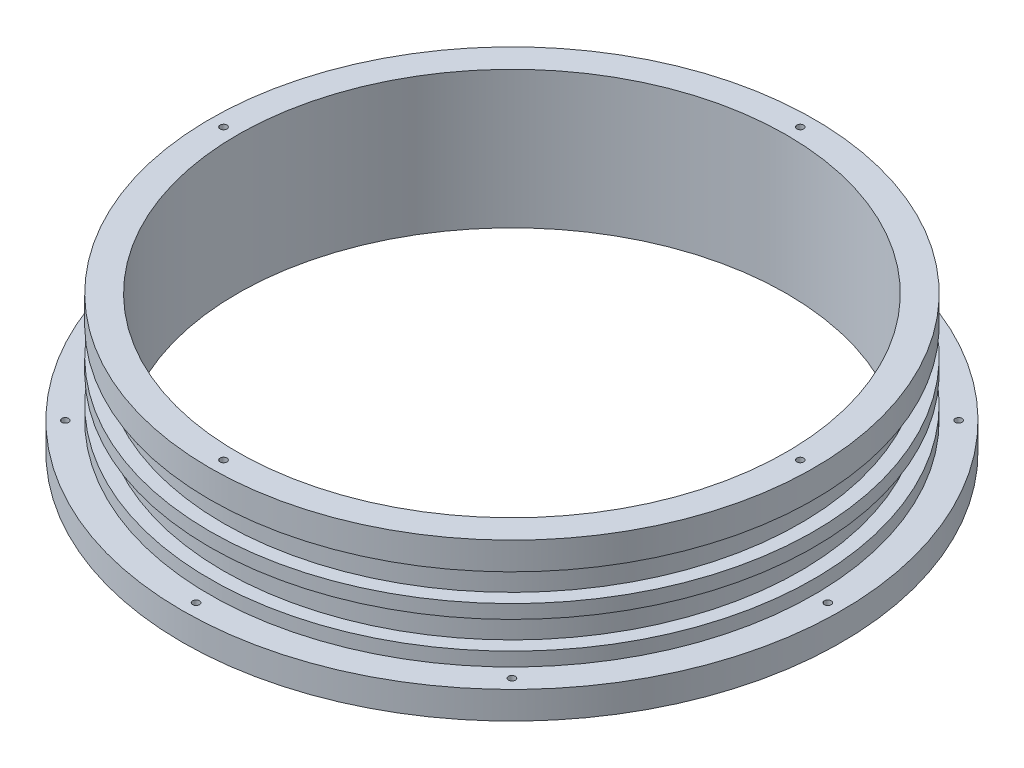
ISO-10303-21;
HEADER;
FILE_DESCRIPTION(('STEP AP214'),'2;1');
FILE_NAME('part.step','',(''),(''),'','','');
FILE_SCHEMA(('AUTOMOTIVE_DESIGN { 1 0 10303 214 1 1 1 1 }'));
ENDSEC;
DATA;
#1=APPLICATION_CONTEXT('core data for automotive mechanical design processes');
#2=APPLICATION_PROTOCOL_DEFINITION('international standard','automotive_design',2000,#1);
#3=PRODUCT_CONTEXT('',#1,'mechanical');
#4=PRODUCT('Part','Part','',(#3));
#5=PRODUCT_RELATED_PRODUCT_CATEGORY('part','',(#4));
#6=PRODUCT_DEFINITION_FORMATION('','',#4);
#7=PRODUCT_DEFINITION_CONTEXT('part definition',#1,'design');
#8=PRODUCT_DEFINITION('design','',#6,#7);
#9=PRODUCT_DEFINITION_SHAPE('','',#8);
#10=(LENGTH_UNIT() NAMED_UNIT(*) SI_UNIT(.MILLI.,.METRE.));
#11=(NAMED_UNIT(*) PLANE_ANGLE_UNIT() SI_UNIT($,.RADIAN.));
#12=(NAMED_UNIT(*) SI_UNIT($,.STERADIAN.) SOLID_ANGLE_UNIT());
#13=UNCERTAINTY_MEASURE_WITH_UNIT(LENGTH_MEASURE(1.E-05),#10,'distance_accuracy_value','');
#14=(GEOMETRIC_REPRESENTATION_CONTEXT(3) GLOBAL_UNCERTAINTY_ASSIGNED_CONTEXT((#13)) GLOBAL_UNIT_ASSIGNED_CONTEXT((#10,
#11,#12)) REPRESENTATION_CONTEXT('',''));
#15=CARTESIAN_POINT('',(0.,0.,0.));
#16=DIRECTION('',(0.,0.,1.));
#17=DIRECTION('',(1.,0.,0.));
#18=AXIS2_PLACEMENT_3D('',#15,#16,#17);
#19=CARTESIAN_POINT('',(0.,0.,0.));
#20=DIRECTION('',(0.,1.,0.));
#21=DIRECTION('',(0.,0.,1.));
#22=AXIS2_PLACEMENT_3D('',#19,#20,#21);
#23=PLANE('',#22);
#24=CARTESIAN_POINT('',(0.,0.,0.));
#25=DIRECTION('',(0.,-1.,0.));
#26=DIRECTION('',(0.,0.,-1.));
#27=AXIS2_PLACEMENT_3D('',#24,#25,#26);
#28=CIRCLE('',#27,63.5);
#29=CARTESIAN_POINT('',(0.,0.,-63.5));
#30=VERTEX_POINT('',#29);
#31=EDGE_CURVE('E73',#30,#30,#28,.T.);
#32=ORIENTED_EDGE('',*,*,#31,.F.);
#33=EDGE_LOOP('',(#32));
#34=FACE_BOUND('',#33,.T.);
#35=CARTESIAN_POINT('',(0.,0.,0.));
#36=DIRECTION('',(0.,-1.,0.));
#37=DIRECTION('',(0.,0.,-1.));
#38=AXIS2_PLACEMENT_3D('',#35,#36,#37);
#39=CIRCLE('',#38,66.675);
#40=CARTESIAN_POINT('',(0.,0.,-66.675));
#41=VERTEX_POINT('',#40);
#42=EDGE_CURVE('E133',#41,#41,#39,.T.);
#43=ORIENTED_EDGE('',*,*,#42,.T.);
#44=EDGE_LOOP('',(#43));
#45=FACE_BOUND('',#44,.T.);
#46=ADVANCED_FACE('F31',(#34,#45),#23,.F.);
#47=CARTESIAN_POINT('',(0.,19.05,0.));
#48=DIRECTION('',(0.,1.,0.));
#49=DIRECTION('',(0.,0.,1.));
#50=AXIS2_PLACEMENT_3D('',#47,#48,#49);
#51=PLANE('',#50);
#52=CARTESIAN_POINT('',(0.,19.05,0.));
#53=DIRECTION('',(0.,1.,0.));
#54=DIRECTION('',(0.,0.,1.));
#55=AXIS2_PLACEMENT_3D('',#52,#53,#54);
#56=CIRCLE('',#55,69.85);
#57=CARTESIAN_POINT('',(0.,19.05,69.85));
#58=VERTEX_POINT('',#57);
#59=EDGE_CURVE('E54',#58,#58,#56,.T.);
#60=ORIENTED_EDGE('',*,*,#59,.T.);
#61=EDGE_LOOP('',(#60));
#62=FACE_BOUND('',#61,.T.);
#63=CARTESIAN_POINT('',(0.,19.05,0.));
#64=DIRECTION('',(0.,1.,0.));
#65=DIRECTION('',(0.,0.,1.));
#66=AXIS2_PLACEMENT_3D('',#63,#64,#65);
#67=CIRCLE('',#66,66.675);
#68=CARTESIAN_POINT('',(0.,19.05,66.675));
#69=VERTEX_POINT('',#68);
#70=EDGE_CURVE('E61',#69,#69,#67,.T.);
#71=ORIENTED_EDGE('',*,*,#70,.F.);
#72=EDGE_LOOP('',(#71));
#73=FACE_BOUND('',#72,.T.);
#74=ADVANCED_FACE('F206',(#62,#73),#51,.T.);
#75=CARTESIAN_POINT('',(0.,9.525,0.));
#76=DIRECTION('',(0.,1.,0.));
#77=DIRECTION('',(0.,0.,1.));
#78=AXIS2_PLACEMENT_3D('',#75,#76,#77);
#79=PLANE('',#78);
#80=CARTESIAN_POINT('',(0.,9.525,0.));
#81=DIRECTION('',(0.,1.,0.));
#82=DIRECTION('',(0.,0.,1.));
#83=AXIS2_PLACEMENT_3D('',#80,#81,#82);
#84=CIRCLE('',#83,69.85);
#85=CARTESIAN_POINT('',(0.,9.525,-69.85));
#86=VERTEX_POINT('',#85);
#87=EDGE_CURVE('E48',#86,#86,#84,.T.);
#88=ORIENTED_EDGE('',*,*,#87,.T.);
#89=EDGE_LOOP('',(#88));
#90=FACE_BOUND('',#89,.T.);
#91=CARTESIAN_POINT('',(0.,9.525,0.));
#92=DIRECTION('',(0.,1.,0.));
#93=DIRECTION('',(0.,0.,1.));
#94=AXIS2_PLACEMENT_3D('',#91,#92,#93);
#95=CIRCLE('',#94,66.675);
#96=CARTESIAN_POINT('',(0.,9.525,66.675));
#97=VERTEX_POINT('',#96);
#98=EDGE_CURVE('E35',#97,#97,#95,.F.);
#99=ORIENTED_EDGE('',*,*,#98,.T.);
#100=EDGE_LOOP('',(#99));
#101=FACE_BOUND('',#100,.T.);
#102=ADVANCED_FACE('F208',(#90,#101),#79,.T.);
#103=CARTESIAN_POINT('',(0.,6.35,0.));
#104=DIRECTION('',(0.,1.,0.));
#105=DIRECTION('',(0.,0.,1.));
#106=AXIS2_PLACEMENT_3D('',#103,#104,#105);
#107=PLANE('',#106);
#108=CARTESIAN_POINT('',(-51.6364726961458,6.35,-51.6364726961432));
#109=DIRECTION('',(0.,1.,0.));
#110=DIRECTION('',(0.,0.,1.));
#111=AXIS2_PLACEMENT_3D('',#108,#109,#110);
#112=CIRCLE('',#111,0.793749999999999);
#113=CARTESIAN_POINT('',(-51.6364726961458,6.35,-50.8427226961432));
#114=VERTEX_POINT('',#113);
#115=EDGE_CURVE('E121',#114,#114,#112,.T.);
#116=ORIENTED_EDGE('',*,*,#115,.F.);
#117=EDGE_LOOP('',(#116));
#118=FACE_BOUND('',#117,.T.);
#119=CARTESIAN_POINT('',(-73.0249999999938,6.35,6.22648643649374E-12));
#120=DIRECTION('',(0.,1.,0.));
#121=DIRECTION('',(0.,0.,1.));
#122=AXIS2_PLACEMENT_3D('',#119,#120,#121);
#123=CIRCLE('',#122,0.793749999999993);
#124=CARTESIAN_POINT('',(-73.0249999999938,6.35,0.793750000006219));
#125=VERTEX_POINT('',#124);
#126=EDGE_CURVE('E115',#125,#125,#123,.T.);
#127=ORIENTED_EDGE('',*,*,#126,.F.);
#128=EDGE_LOOP('',(#127));
#129=FACE_BOUND('',#128,.T.);
#130=CARTESIAN_POINT('',(-51.636472696137,6.35,51.636472696152));
#131=DIRECTION('',(0.,1.,0.));
#132=DIRECTION('',(0.,0.,1.));
#133=AXIS2_PLACEMENT_3D('',#130,#131,#132);
#134=CIRCLE('',#133,0.793749999999999);
#135=CARTESIAN_POINT('',(-51.636472696137,6.35,52.430222696152));
#136=VERTEX_POINT('',#135);
#137=EDGE_CURVE('E109',#136,#136,#134,.T.);
#138=ORIENTED_EDGE('',*,*,#137,.F.);
#139=EDGE_LOOP('',(#138));
#140=FACE_BOUND('',#139,.T.);
#141=CARTESIAN_POINT('',(1.24350869064859E-11,6.35,73.025));
#142=DIRECTION('',(0.,1.,0.));
#143=DIRECTION('',(0.,0.,1.));
#144=AXIS2_PLACEMENT_3D('',#141,#142,#143);
#145=CIRCLE('',#144,0.79375);
#146=CARTESIAN_POINT('',(1.24350869064859E-11,6.35,73.81875));
#147=VERTEX_POINT('',#146);
#148=EDGE_CURVE('E103',#147,#147,#145,.T.);
#149=ORIENTED_EDGE('',*,*,#148,.F.);
#150=EDGE_LOOP('',(#149));
#151=FACE_BOUND('',#150,.T.);
#152=CARTESIAN_POINT('',(51.6364726961582,6.35,51.6364726961432));
#153=DIRECTION('',(0.,1.,0.));
#154=DIRECTION('',(0.,0.,1.));
#155=AXIS2_PLACEMENT_3D('',#152,#153,#154);
#156=CIRCLE('',#155,0.793749999999999);
#157=CARTESIAN_POINT('',(51.6364726961582,6.35,52.4302226961432));
#158=VERTEX_POINT('',#157);
#159=EDGE_CURVE('E97',#158,#158,#156,.T.);
#160=ORIENTED_EDGE('',*,*,#159,.F.);
#161=EDGE_LOOP('',(#160));
#162=FACE_BOUND('',#161,.T.);
#163=CARTESIAN_POINT('',(73.0250000000062,6.35,-6.21754345324296E-12));
#164=DIRECTION('',(0.,1.,0.));
#165=DIRECTION('',(0.,0.,1.));
#166=AXIS2_PLACEMENT_3D('',#163,#164,#165);
#167=CIRCLE('',#166,0.793749999999993);
#168=CARTESIAN_POINT('',(73.0250000000062,6.35,0.793749999993775));
#169=VERTEX_POINT('',#168);
#170=EDGE_CURVE('E91',#169,#169,#167,.T.);
#171=ORIENTED_EDGE('',*,*,#170,.F.);
#172=EDGE_LOOP('',(#171));
#173=FACE_BOUND('',#172,.T.);
#174=CARTESIAN_POINT('',(51.6364726961494,6.35,-51.636472696152));
#175=DIRECTION('',(0.,1.,0.));
#176=DIRECTION('',(0.,0.,1.));
#177=AXIS2_PLACEMENT_3D('',#174,#175,#176);
#178=CIRCLE('',#177,0.793749999999999);
#179=CARTESIAN_POINT('',(51.6364726961494,6.35,-50.842722696152));
#180=VERTEX_POINT('',#179);
#181=EDGE_CURVE('E85',#180,#180,#178,.T.);
#182=ORIENTED_EDGE('',*,*,#181,.F.);
#183=EDGE_LOOP('',(#182));
#184=FACE_BOUND('',#183,.T.);
#185=CARTESIAN_POINT('',(0.,6.35,-73.025));
#186=DIRECTION('',(0.,1.,0.));
#187=DIRECTION('',(0.,0.,1.));
#188=AXIS2_PLACEMENT_3D('',#185,#186,#187);
#189=CIRCLE('',#188,0.79375);
#190=CARTESIAN_POINT('',(0.,6.35,-72.23125));
#191=VERTEX_POINT('',#190);
#192=EDGE_CURVE('E79',#191,#191,#189,.T.);
#193=ORIENTED_EDGE('',*,*,#192,.F.);
#194=EDGE_LOOP('',(#193));
#195=FACE_BOUND('',#194,.T.);
#196=CARTESIAN_POINT('',(0.,6.35,0.));
#197=DIRECTION('',(0.,1.,0.));
#198=DIRECTION('',(0.,0.,1.));
#199=AXIS2_PLACEMENT_3D('',#196,#197,#198);
#200=CIRCLE('',#199,76.2);
#201=CARTESIAN_POINT('',(0.,6.35,76.2));
#202=VERTEX_POINT('',#201);
#203=EDGE_CURVE('E10',#202,#202,#200,.T.);
#204=ORIENTED_EDGE('',*,*,#203,.T.);
#205=EDGE_LOOP('',(#204));
#206=FACE_BOUND('',#205,.T.);
#207=CARTESIAN_POINT('',(0.,6.35,0.));
#208=DIRECTION('',(0.,1.,0.));
#209=DIRECTION('',(0.,0.,1.));
#210=AXIS2_PLACEMENT_3D('',#207,#208,#209);
#211=CIRCLE('',#210,69.85);
#212=CARTESIAN_POINT('',(0.,6.35,-69.85));
#213=VERTEX_POINT('',#212);
#214=EDGE_CURVE('E44',#213,#213,#211,.F.);
#215=ORIENTED_EDGE('',*,*,#214,.T.);
#216=EDGE_LOOP('',(#215));
#217=FACE_BOUND('',#216,.T.);
#218=ADVANCED_FACE('F215',(#118,#129,#140,#151,#162,#173,#184,#195,#206,#217),#107,.T.);
#219=CARTESIAN_POINT('',(0.,6.35,0.));
#220=DIRECTION('',(0.,-1.,0.));
#221=DIRECTION('',(0.,0.,-1.));
#222=AXIS2_PLACEMENT_3D('',#219,#220,#221);
#223=CYLINDRICAL_SURFACE('',#222,76.2);
#224=ORIENTED_EDGE('',*,*,#203,.F.);
#225=EDGE_LOOP('',(#224));
#226=FACE_BOUND('',#225,.T.);
#227=CARTESIAN_POINT('',(0.,0.,0.));
#228=DIRECTION('',(0.,1.,0.));
#229=DIRECTION('',(0.,0.,1.));
#230=AXIS2_PLACEMENT_3D('',#227,#228,#229);
#231=CIRCLE('',#230,76.2);
#232=CARTESIAN_POINT('',(0.,0.,76.2));
#233=VERTEX_POINT('',#232);
#234=EDGE_CURVE('E39',#233,#233,#231,.T.);
#235=ORIENTED_EDGE('',*,*,#234,.T.);
#236=EDGE_LOOP('',(#235));
#237=FACE_BOUND('',#236,.T.);
#238=ADVANCED_FACE('F33',(#226,#237),#223,.T.);
#239=CARTESIAN_POINT('',(0.,0.,0.));
#240=DIRECTION('',(0.,-1.,0.));
#241=DIRECTION('',(0.,0.,-1.));
#242=AXIS2_PLACEMENT_3D('',#239,#240,#241);
#243=CIRCLE('',#242,69.85);
#244=CARTESIAN_POINT('',(0.,0.,-69.85));
#245=VERTEX_POINT('',#244);
#246=EDGE_CURVE('E127',#245,#245,#243,.T.);
#247=ORIENTED_EDGE('',*,*,#246,.F.);
#248=EDGE_LOOP('',(#247));
#249=FACE_BOUND('',#248,.T.);
#250=CARTESIAN_POINT('',(-51.6364726961458,0.,-51.6364726961432));
#251=DIRECTION('',(0.,1.,0.));
#252=DIRECTION('',(0.,0.,1.));
#253=AXIS2_PLACEMENT_3D('',#250,#251,#252);
#254=CIRCLE('',#253,0.793749999999999);
#255=CARTESIAN_POINT('',(-51.6364726961458,0.,-50.8427226961432));
#256=VERTEX_POINT('',#255);
#257=EDGE_CURVE('E118',#256,#256,#254,.T.);
#258=ORIENTED_EDGE('',*,*,#257,.T.);
#259=EDGE_LOOP('',(#258));
#260=FACE_BOUND('',#259,.T.);
#261=CARTESIAN_POINT('',(-73.0249999999938,0.,6.22648643649374E-12));
#262=DIRECTION('',(0.,1.,0.));
#263=DIRECTION('',(0.,0.,1.));
#264=AXIS2_PLACEMENT_3D('',#261,#262,#263);
#265=CIRCLE('',#264,0.793749999999993);
#266=CARTESIAN_POINT('',(-73.0249999999938,0.,0.793750000006219));
#267=VERTEX_POINT('',#266);
#268=EDGE_CURVE('E112',#267,#267,#265,.T.);
#269=ORIENTED_EDGE('',*,*,#268,.T.);
#270=EDGE_LOOP('',(#269));
#271=FACE_BOUND('',#270,.T.);
#272=CARTESIAN_POINT('',(-51.636472696137,0.,51.636472696152));
#273=DIRECTION('',(0.,1.,0.));
#274=DIRECTION('',(0.,0.,1.));
#275=AXIS2_PLACEMENT_3D('',#272,#273,#274);
#276=CIRCLE('',#275,0.793749999999999);
#277=CARTESIAN_POINT('',(-51.636472696137,0.,52.430222696152));
#278=VERTEX_POINT('',#277);
#279=EDGE_CURVE('E106',#278,#278,#276,.T.);
#280=ORIENTED_EDGE('',*,*,#279,.T.);
#281=EDGE_LOOP('',(#280));
#282=FACE_BOUND('',#281,.T.);
#283=CARTESIAN_POINT('',(1.24350869064859E-11,0.,73.025));
#284=DIRECTION('',(0.,1.,0.));
#285=DIRECTION('',(0.,0.,1.));
#286=AXIS2_PLACEMENT_3D('',#283,#284,#285);
#287=CIRCLE('',#286,0.79375);
#288=CARTESIAN_POINT('',(1.24350869064859E-11,0.,73.81875));
#289=VERTEX_POINT('',#288);
#290=EDGE_CURVE('E100',#289,#289,#287,.T.);
#291=ORIENTED_EDGE('',*,*,#290,.T.);
#292=EDGE_LOOP('',(#291));
#293=FACE_BOUND('',#292,.T.);
#294=CARTESIAN_POINT('',(51.6364726961582,0.,51.6364726961432));
#295=DIRECTION('',(0.,1.,0.));
#296=DIRECTION('',(0.,0.,1.));
#297=AXIS2_PLACEMENT_3D('',#294,#295,#296);
#298=CIRCLE('',#297,0.793749999999999);
#299=CARTESIAN_POINT('',(51.6364726961582,0.,52.4302226961432));
#300=VERTEX_POINT('',#299);
#301=EDGE_CURVE('E94',#300,#300,#298,.T.);
#302=ORIENTED_EDGE('',*,*,#301,.T.);
#303=EDGE_LOOP('',(#302));
#304=FACE_BOUND('',#303,.T.);
#305=CARTESIAN_POINT('',(73.0250000000062,0.,-6.21754345324296E-12));
#306=DIRECTION('',(0.,1.,0.));
#307=DIRECTION('',(0.,0.,1.));
#308=AXIS2_PLACEMENT_3D('',#305,#306,#307);
#309=CIRCLE('',#308,0.793749999999993);
#310=CARTESIAN_POINT('',(73.0250000000062,0.,0.793749999993775));
#311=VERTEX_POINT('',#310);
#312=EDGE_CURVE('E88',#311,#311,#309,.T.);
#313=ORIENTED_EDGE('',*,*,#312,.T.);
#314=EDGE_LOOP('',(#313));
#315=FACE_BOUND('',#314,.T.);
#316=CARTESIAN_POINT('',(51.6364726961494,0.,-51.636472696152));
#317=DIRECTION('',(0.,1.,0.));
#318=DIRECTION('',(0.,0.,1.));
#319=AXIS2_PLACEMENT_3D('',#316,#317,#318);
#320=CIRCLE('',#319,0.793749999999999);
#321=CARTESIAN_POINT('',(51.6364726961494,0.,-50.842722696152));
#322=VERTEX_POINT('',#321);
#323=EDGE_CURVE('E82',#322,#322,#320,.T.);
#324=ORIENTED_EDGE('',*,*,#323,.T.);
#325=EDGE_LOOP('',(#324));
#326=FACE_BOUND('',#325,.T.);
#327=CARTESIAN_POINT('',(0.,0.,-73.025));
#328=DIRECTION('',(0.,1.,0.));
#329=DIRECTION('',(0.,0.,1.));
#330=AXIS2_PLACEMENT_3D('',#327,#328,#329);
#331=CIRCLE('',#330,0.79375);
#332=CARTESIAN_POINT('',(0.,0.,-72.23125));
#333=VERTEX_POINT('',#332);
#334=EDGE_CURVE('E76',#333,#333,#331,.T.);
#335=ORIENTED_EDGE('',*,*,#334,.T.);
#336=EDGE_LOOP('',(#335));
#337=FACE_BOUND('',#336,.T.);
#338=ORIENTED_EDGE('',*,*,#234,.F.);
#339=EDGE_LOOP('',(#338));
#340=FACE_BOUND('',#339,.T.);
#341=ADVANCED_FACE('F219',(#249,#260,#271,#282,#293,#304,#315,#326,#337,#340),#23,.F.);
#342=CARTESIAN_POINT('',(0.,9.525,0.));
#343=DIRECTION('',(0.,-1.,0.));
#344=DIRECTION('',(0.,0.,-1.));
#345=AXIS2_PLACEMENT_3D('',#342,#343,#344);
#346=CYLINDRICAL_SURFACE('',#345,69.85);
#347=CARTESIAN_POINT('',(0.,6.35,-69.85));
#348=CARTESIAN_POINT('',(0.,6.38307291666667,-69.85));
#349=CARTESIAN_POINT('',(0.,6.41614583333333,-69.85));
#350=CARTESIAN_POINT('',(0.,6.48229166666667,-69.85));
#351=CARTESIAN_POINT('',(0.,6.51536458333333,-69.85));
#352=CARTESIAN_POINT('',(0.,6.58151041666667,-69.85));
#353=CARTESIAN_POINT('',(0.,6.61458333333333,-69.85));
#354=CARTESIAN_POINT('',(0.,6.68072916666667,-69.85));
#355=CARTESIAN_POINT('',(0.,6.71380208333333,-69.85));
#356=CARTESIAN_POINT('',(0.,6.77994791666667,-69.85));
#357=CARTESIAN_POINT('',(0.,6.81302083333333,-69.85));
#358=CARTESIAN_POINT('',(0.,6.87916666666667,-69.85));
#359=CARTESIAN_POINT('',(0.,6.91223958333333,-69.85));
#360=CARTESIAN_POINT('',(0.,6.97838541666667,-69.85));
#361=CARTESIAN_POINT('',(0.,7.01145833333333,-69.85));
#362=CARTESIAN_POINT('',(0.,7.07760416666667,-69.85));
#363=CARTESIAN_POINT('',(0.,7.11067708333333,-69.85));
#364=CARTESIAN_POINT('',(0.,7.17682291666667,-69.85));
#365=CARTESIAN_POINT('',(0.,7.20989583333333,-69.85));
#366=CARTESIAN_POINT('',(0.,7.27604166666667,-69.85));
#367=CARTESIAN_POINT('',(0.,7.30911458333333,-69.85));
#368=CARTESIAN_POINT('',(0.,7.37526041666667,-69.85));
#369=CARTESIAN_POINT('',(0.,7.40833333333333,-69.85));
#370=CARTESIAN_POINT('',(0.,7.47447916666667,-69.85));
#371=CARTESIAN_POINT('',(0.,7.50755208333333,-69.85));
#372=CARTESIAN_POINT('',(0.,7.57369791666667,-69.85));
#373=CARTESIAN_POINT('',(0.,7.60677083333333,-69.85));
#374=CARTESIAN_POINT('',(0.,7.67291666666667,-69.85));
#375=CARTESIAN_POINT('',(0.,7.70598958333333,-69.85));
#376=CARTESIAN_POINT('',(0.,7.77213541666667,-69.85));
#377=CARTESIAN_POINT('',(0.,7.80520833333333,-69.85));
#378=CARTESIAN_POINT('',(0.,7.87135416666667,-69.85));
#379=CARTESIAN_POINT('',(0.,7.90442708333333,-69.85));
#380=CARTESIAN_POINT('',(0.,7.97057291666667,-69.85));
#381=CARTESIAN_POINT('',(0.,8.00364583333333,-69.85));
#382=CARTESIAN_POINT('',(0.,8.06979166666667,-69.85));
#383=CARTESIAN_POINT('',(0.,8.10286458333333,-69.85));
#384=CARTESIAN_POINT('',(0.,8.16901041666667,-69.85));
#385=CARTESIAN_POINT('',(0.,8.20208333333333,-69.85));
#386=CARTESIAN_POINT('',(0.,8.26822916666667,-69.85));
#387=CARTESIAN_POINT('',(0.,8.30130208333333,-69.85));
#388=CARTESIAN_POINT('',(0.,8.36744791666667,-69.85));
#389=CARTESIAN_POINT('',(0.,8.40052083333333,-69.85));
#390=CARTESIAN_POINT('',(0.,8.46666666666667,-69.85));
#391=CARTESIAN_POINT('',(0.,8.49973958333333,-69.85));
#392=CARTESIAN_POINT('',(0.,8.56588541666667,-69.85));
#393=CARTESIAN_POINT('',(0.,8.59895833333333,-69.85));
#394=CARTESIAN_POINT('',(0.,8.66510416666667,-69.85));
#395=CARTESIAN_POINT('',(0.,8.69817708333333,-69.85));
#396=CARTESIAN_POINT('',(0.,8.76432291666667,-69.85));
#397=CARTESIAN_POINT('',(0.,8.79739583333333,-69.85));
#398=CARTESIAN_POINT('',(0.,8.86354166666666,-69.85));
#399=CARTESIAN_POINT('',(0.,8.89661458333333,-69.85));
#400=CARTESIAN_POINT('',(0.,8.96276041666667,-69.85));
#401=CARTESIAN_POINT('',(0.,8.99583333333333,-69.85));
#402=CARTESIAN_POINT('',(0.,9.06197916666667,-69.85));
#403=CARTESIAN_POINT('',(0.,9.09505208333333,-69.85));
#404=CARTESIAN_POINT('',(0.,9.16119791666667,-69.85));
#405=CARTESIAN_POINT('',(0.,9.19427083333333,-69.85));
#406=CARTESIAN_POINT('',(0.,9.26041666666667,-69.85));
#407=CARTESIAN_POINT('',(0.,9.29348958333333,-69.85));
#408=CARTESIAN_POINT('',(0.,9.35963541666667,-69.85));
#409=CARTESIAN_POINT('',(0.,9.39270833333333,-69.85));
#410=CARTESIAN_POINT('',(0.,9.45885416666667,-69.85));
#411=CARTESIAN_POINT('',(0.,9.49192708333333,-69.85));
#412=CARTESIAN_POINT('',(0.,9.525,-69.85));
#413=B_SPLINE_CURVE_WITH_KNOTS('',3,(#347,#348,#349,#350,#351,#352,#353,#354,#355,#356,#357,
#358,#359,#360,#361,#362,#363,#364,#365,#366,#367,#368,#369,#370,#371,#372,#373,#374,#375,#376,
#377,#378,#379,#380,#381,#382,#383,#384,#385,#386,#387,#388,#389,#390,#391,#392,#393,#394,#395,
#396,#397,#398,#399,#400,#401,#402,#403,#404,#405,#406,#407,#408,#409,#410,#411,#412),
.UNSPECIFIED.,.F.,.F.,(4,2,2,2,2,2,2,2,2,2,2,2,2,2,2,2,2,2,2,2,2,2,2,2,2,2,2,2,2,2,2,2,4),(0.,
0.0992187499999995,0.198437499999999,0.29765625,0.396875,0.496093749999999,0.5953125,0.69453125,
0.793749999999999,0.89296875,0.9921875,1.09140625,1.190625,1.28984375,1.3890625,1.48828125,
1.5875,1.68671875,1.7859375,1.88515625,1.984375,2.08359375,2.1828125,2.28203125,2.38125,
2.48046875,2.5796875,2.67890625,2.778125,2.87734375,2.9765625,3.07578125,3.175),.UNSPECIFIED.);
#414=EDGE_CURVE('BSEAM230',#213,#86,#413,.T.);
#415=ORIENTED_EDGE('',*,*,#214,.F.);
#416=ORIENTED_EDGE('',*,*,#87,.F.);
#417=ORIENTED_EDGE('',*,*,#414,.T.);
#418=ORIENTED_EDGE('',*,*,#414,.F.);
#419=EDGE_LOOP('',(#415,#417,#416,#418));
#420=FACE_BOUND('',#419,.T.);
#421=ADVANCED_FACE('F230',(#420),#346,.T.);
#422=CARTESIAN_POINT('',(0.,15.875,0.));
#423=DIRECTION('',(0.,-1.,0.));
#424=DIRECTION('',(0.,0.,-1.));
#425=AXIS2_PLACEMENT_3D('',#422,#423,#424);
#426=CYLINDRICAL_SURFACE('',#425,66.675);
#427=ORIENTED_EDGE('',*,*,#98,.F.);
#428=EDGE_LOOP('',(#427));
#429=FACE_BOUND('',#428,.T.);
#430=CARTESIAN_POINT('',(0.,15.875,0.));
#431=DIRECTION('',(0.,1.,0.));
#432=DIRECTION('',(0.,0.,1.));
#433=AXIS2_PLACEMENT_3D('',#430,#431,#432);
#434=CIRCLE('',#433,66.675);
#435=CARTESIAN_POINT('',(0.,15.875,66.675));
#436=VERTEX_POINT('',#435);
#437=EDGE_CURVE('E51',#436,#436,#434,.T.);
#438=ORIENTED_EDGE('',*,*,#437,.F.);
#439=EDGE_LOOP('',(#438));
#440=FACE_BOUND('',#439,.T.);
#441=ADVANCED_FACE('F224',(#429,#440),#426,.T.);
#442=CARTESIAN_POINT('',(0.,15.875,0.));
#443=DIRECTION('',(0.,1.,0.));
#444=DIRECTION('',(0.,0.,1.));
#445=AXIS2_PLACEMENT_3D('',#442,#443,#444);
#446=PLANE('',#445);
#447=CARTESIAN_POINT('',(0.,15.875,0.));
#448=DIRECTION('',(0.,1.,0.));
#449=DIRECTION('',(0.,0.,1.));
#450=AXIS2_PLACEMENT_3D('',#447,#448,#449);
#451=CIRCLE('',#450,69.85);
#452=CARTESIAN_POINT('',(0.,15.875,69.85));
#453=VERTEX_POINT('',#452);
#454=EDGE_CURVE('E55',#453,#453,#451,.T.);
#455=ORIENTED_EDGE('',*,*,#454,.F.);
#456=EDGE_LOOP('',(#455));
#457=FACE_BOUND('',#456,.T.);
#458=ORIENTED_EDGE('',*,*,#437,.T.);
#459=EDGE_LOOP('',(#458));
#460=FACE_BOUND('',#459,.T.);
#461=ADVANCED_FACE('F221',(#457,#460),#446,.F.);
#462=CARTESIAN_POINT('',(0.,19.05,0.));
#463=DIRECTION('',(0.,-1.,0.));
#464=DIRECTION('',(0.,0.,-1.));
#465=AXIS2_PLACEMENT_3D('',#462,#463,#464);
#466=CYLINDRICAL_SURFACE('',#465,69.85);
#467=ORIENTED_EDGE('',*,*,#59,.F.);
#468=EDGE_LOOP('',(#467));
#469=FACE_BOUND('',#468,.T.);
#470=ORIENTED_EDGE('',*,*,#454,.T.);
#471=EDGE_LOOP('',(#470));
#472=FACE_BOUND('',#471,.T.);
#473=ADVANCED_FACE('F202',(#469,#472),#466,.T.);
#474=CARTESIAN_POINT('',(0.,25.4,0.));
#475=DIRECTION('',(0.,-1.,0.));
#476=DIRECTION('',(0.,0.,-1.));
#477=AXIS2_PLACEMENT_3D('',#474,#475,#476);
#478=CYLINDRICAL_SURFACE('',#477,66.675);
#479=CARTESIAN_POINT('',(0.,25.4,0.));
#480=DIRECTION('',(0.,1.,0.));
#481=DIRECTION('',(0.,0.,1.));
#482=AXIS2_PLACEMENT_3D('',#479,#480,#481);
#483=CIRCLE('',#482,66.675);
#484=CARTESIAN_POINT('',(0.,25.4,66.675));
#485=VERTEX_POINT('',#484);
#486=EDGE_CURVE('E58',#485,#485,#483,.T.);
#487=ORIENTED_EDGE('',*,*,#486,.F.);
#488=EDGE_LOOP('',(#487));
#489=FACE_BOUND('',#488,.T.);
#490=ORIENTED_EDGE('',*,*,#70,.T.);
#491=EDGE_LOOP('',(#490));
#492=FACE_BOUND('',#491,.T.);
#493=ADVANCED_FACE('F196',(#489,#492),#478,.T.);
#494=CARTESIAN_POINT('',(0.,25.4,0.));
#495=DIRECTION('',(0.,1.,0.));
#496=DIRECTION('',(0.,0.,1.));
#497=AXIS2_PLACEMENT_3D('',#494,#495,#496);
#498=PLANE('',#497);
#499=CARTESIAN_POINT('',(0.,25.4,0.));
#500=DIRECTION('',(0.,1.,0.));
#501=DIRECTION('',(0.,0.,1.));
#502=AXIS2_PLACEMENT_3D('',#499,#500,#501);
#503=CIRCLE('',#502,69.85);
#504=CARTESIAN_POINT('',(0.,25.4,69.85));
#505=VERTEX_POINT('',#504);
#506=EDGE_CURVE('E67',#505,#505,#503,.T.);
#507=ORIENTED_EDGE('',*,*,#506,.F.);
#508=EDGE_LOOP('',(#507));
#509=FACE_BOUND('',#508,.T.);
#510=ORIENTED_EDGE('',*,*,#486,.T.);
#511=EDGE_LOOP('',(#510));
#512=FACE_BOUND('',#511,.T.);
#513=ADVANCED_FACE('F190',(#509,#512),#498,.F.);
#514=CARTESIAN_POINT('',(0.,31.75,0.));
#515=DIRECTION('',(0.,-1.,0.));
#516=DIRECTION('',(0.,0.,-1.));
#517=AXIS2_PLACEMENT_3D('',#514,#515,#516);
#518=CYLINDRICAL_SURFACE('',#517,69.85);
#519=CARTESIAN_POINT('',(0.,31.75,0.));
#520=DIRECTION('',(0.,1.,0.));
#521=DIRECTION('',(0.,0.,1.));
#522=AXIS2_PLACEMENT_3D('',#519,#520,#521);
#523=CIRCLE('',#522,69.85);
#524=CARTESIAN_POINT('',(0.,31.75,69.85));
#525=VERTEX_POINT('',#524);
#526=EDGE_CURVE('E64',#525,#525,#523,.T.);
#527=ORIENTED_EDGE('',*,*,#526,.F.);
#528=EDGE_LOOP('',(#527));
#529=FACE_BOUND('',#528,.T.);
#530=ORIENTED_EDGE('',*,*,#506,.T.);
#531=EDGE_LOOP('',(#530));
#532=FACE_BOUND('',#531,.T.);
#533=ADVANCED_FACE('F176',(#529,#532),#518,.T.);
#534=CARTESIAN_POINT('',(0.,31.75,0.));
#535=DIRECTION('',(0.,1.,0.));
#536=DIRECTION('',(0.,0.,1.));
#537=AXIS2_PLACEMENT_3D('',#534,#535,#536);
#538=PLANE('',#537);
#539=CARTESIAN_POINT('',(-66.6749999999981,31.75,1.89501788077599E-12));
#540=DIRECTION('',(0.,1.,0.));
#541=DIRECTION('',(0.,0.,1.));
#542=AXIS2_PLACEMENT_3D('',#539,#540,#541);
#543=CIRCLE('',#542,0.793750000003026);
#544=CARTESIAN_POINT('',(-66.6749999999981,31.75,0.793750000004921));
#545=VERTEX_POINT('',#544);
#546=EDGE_CURVE('E157',#545,#545,#543,.T.);
#547=ORIENTED_EDGE('',*,*,#546,.F.);
#548=EDGE_LOOP('',(#547));
#549=FACE_BOUND('',#548,.T.);
#550=CARTESIAN_POINT('',(3.77370509648536E-12,31.75,66.675));
#551=DIRECTION('',(0.,1.,0.));
#552=DIRECTION('',(0.,0.,1.));
#553=AXIS2_PLACEMENT_3D('',#550,#551,#552);
#554=CIRCLE('',#553,0.793750000004055);
#555=CARTESIAN_POINT('',(3.77370509648536E-12,31.75,67.4687500000041));
#556=VERTEX_POINT('',#555);
#557=EDGE_CURVE('E151',#556,#556,#554,.T.);
#558=ORIENTED_EDGE('',*,*,#557,.F.);
#559=EDGE_LOOP('',(#558));
#560=FACE_BOUND('',#559,.T.);
#561=CARTESIAN_POINT('',(66.6750000000019,31.75,-1.88685254824268E-12));
#562=DIRECTION('',(0.,1.,0.));
#563=DIRECTION('',(0.,0.,1.));
#564=AXIS2_PLACEMENT_3D('',#561,#562,#563);
#565=CIRCLE('',#564,0.79375000000148);
#566=CARTESIAN_POINT('',(66.6750000000019,31.75,0.793749999999593));
#567=VERTEX_POINT('',#566);
#568=EDGE_CURVE('E145',#567,#567,#565,.T.);
#569=ORIENTED_EDGE('',*,*,#568,.F.);
#570=EDGE_LOOP('',(#569));
#571=FACE_BOUND('',#570,.T.);
#572=CARTESIAN_POINT('',(0.,31.75,-66.675));
#573=DIRECTION('',(0.,1.,0.));
#574=DIRECTION('',(0.,0.,1.));
#575=AXIS2_PLACEMENT_3D('',#572,#573,#574);
#576=CIRCLE('',#575,0.79375);
#577=CARTESIAN_POINT('',(0.,31.75,-65.88125));
#578=VERTEX_POINT('',#577);
#579=EDGE_CURVE('E139',#578,#578,#576,.T.);
#580=ORIENTED_EDGE('',*,*,#579,.F.);
#581=EDGE_LOOP('',(#580));
#582=FACE_BOUND('',#581,.T.);
#583=CARTESIAN_POINT('',(0.,31.75,0.));
#584=DIRECTION('',(0.,-1.,0.));
#585=DIRECTION('',(0.,0.,-1.));
#586=AXIS2_PLACEMENT_3D('',#583,#584,#585);
#587=CIRCLE('',#586,63.5);
#588=CARTESIAN_POINT('',(0.,31.75,-63.5));
#589=VERTEX_POINT('',#588);
#590=EDGE_CURVE('E70',#589,#589,#587,.T.);
#591=ORIENTED_EDGE('',*,*,#590,.T.);
#592=EDGE_LOOP('',(#591));
#593=FACE_BOUND('',#592,.T.);
#594=ORIENTED_EDGE('',*,*,#526,.T.);
#595=EDGE_LOOP('',(#594));
#596=FACE_BOUND('',#595,.T.);
#597=ADVANCED_FACE('F172',(#549,#560,#571,#582,#593,#596),#538,.T.);
#598=CARTESIAN_POINT('',(0.,31.75,0.));
#599=DIRECTION('',(0.,-1.,0.));
#600=DIRECTION('',(0.,0.,-1.));
#601=AXIS2_PLACEMENT_3D('',#598,#599,#600);
#602=CYLINDRICAL_SURFACE('',#601,63.5);
#603=ORIENTED_EDGE('',*,*,#590,.F.);
#604=EDGE_LOOP('',(#603));
#605=FACE_BOUND('',#604,.T.);
#606=ORIENTED_EDGE('',*,*,#31,.T.);
#607=EDGE_LOOP('',(#606));
#608=FACE_BOUND('',#607,.T.);
#609=ADVANCED_FACE('F175',(#605,#608),#602,.F.);
#610=CARTESIAN_POINT('',(0.,0.,-73.025));
#611=DIRECTION('',(0.,1.,0.));
#612=DIRECTION('',(0.,0.,1.));
#613=AXIS2_PLACEMENT_3D('',#610,#611,#612);
#614=CYLINDRICAL_SURFACE('',#613,0.79375);
#615=ORIENTED_EDGE('',*,*,#334,.F.);
#616=EDGE_LOOP('',(#615));
#617=FACE_BOUND('',#616,.T.);
#618=ORIENTED_EDGE('',*,*,#192,.T.);
#619=EDGE_LOOP('',(#618));
#620=FACE_BOUND('',#619,.T.);
#621=ADVANCED_FACE('F265',(#617,#620),#614,.F.);
#622=CARTESIAN_POINT('',(51.6364726961494,0.,-51.636472696152));
#623=DIRECTION('',(0.,1.,0.));
#624=DIRECTION('',(0.,0.,1.));
#625=AXIS2_PLACEMENT_3D('',#622,#623,#624);
#626=CYLINDRICAL_SURFACE('',#625,0.793749999999999);
#627=ORIENTED_EDGE('',*,*,#323,.F.);
#628=EDGE_LOOP('',(#627));
#629=FACE_BOUND('',#628,.T.);
#630=ORIENTED_EDGE('',*,*,#181,.T.);
#631=EDGE_LOOP('',(#630));
#632=FACE_BOUND('',#631,.T.);
#633=ADVANCED_FACE('F268',(#629,#632),#626,.F.);
#634=CARTESIAN_POINT('',(73.0250000000062,0.,-6.21754345324296E-12));
#635=DIRECTION('',(0.,1.,0.));
#636=DIRECTION('',(0.,0.,1.));
#637=AXIS2_PLACEMENT_3D('',#634,#635,#636);
#638=CYLINDRICAL_SURFACE('',#637,0.793749999999993);
#639=ORIENTED_EDGE('',*,*,#312,.F.);
#640=EDGE_LOOP('',(#639));
#641=FACE_BOUND('',#640,.T.);
#642=ORIENTED_EDGE('',*,*,#170,.T.);
#643=EDGE_LOOP('',(#642));
#644=FACE_BOUND('',#643,.T.);
#645=ADVANCED_FACE('F286',(#641,#644),#638,.F.);
#646=CARTESIAN_POINT('',(51.6364726961582,0.,51.6364726961432));
#647=DIRECTION('',(0.,1.,0.));
#648=DIRECTION('',(0.,0.,1.));
#649=AXIS2_PLACEMENT_3D('',#646,#647,#648);
#650=CYLINDRICAL_SURFACE('',#649,0.793749999999999);
#651=ORIENTED_EDGE('',*,*,#301,.F.);
#652=EDGE_LOOP('',(#651));
#653=FACE_BOUND('',#652,.T.);
#654=ORIENTED_EDGE('',*,*,#159,.T.);
#655=EDGE_LOOP('',(#654));
#656=FACE_BOUND('',#655,.T.);
#657=ADVANCED_FACE('F294',(#653,#656),#650,.F.);
#658=CARTESIAN_POINT('',(1.24350869064859E-11,0.,73.025));
#659=DIRECTION('',(0.,1.,0.));
#660=DIRECTION('',(0.,0.,1.));
#661=AXIS2_PLACEMENT_3D('',#658,#659,#660);
#662=CYLINDRICAL_SURFACE('',#661,0.79375);
#663=ORIENTED_EDGE('',*,*,#290,.F.);
#664=EDGE_LOOP('',(#663));
#665=FACE_BOUND('',#664,.T.);
#666=ORIENTED_EDGE('',*,*,#148,.T.);
#667=EDGE_LOOP('',(#666));
#668=FACE_BOUND('',#667,.T.);
#669=ADVANCED_FACE('F298',(#665,#668),#662,.F.);
#670=CARTESIAN_POINT('',(-51.636472696137,0.,51.636472696152));
#671=DIRECTION('',(0.,1.,0.));
#672=DIRECTION('',(0.,0.,1.));
#673=AXIS2_PLACEMENT_3D('',#670,#671,#672);
#674=CYLINDRICAL_SURFACE('',#673,0.793749999999999);
#675=ORIENTED_EDGE('',*,*,#279,.F.);
#676=EDGE_LOOP('',(#675));
#677=FACE_BOUND('',#676,.T.);
#678=ORIENTED_EDGE('',*,*,#137,.T.);
#679=EDGE_LOOP('',(#678));
#680=FACE_BOUND('',#679,.T.);
#681=ADVANCED_FACE('F302',(#677,#680),#674,.F.);
#682=CARTESIAN_POINT('',(-73.0249999999938,0.,6.22648643649374E-12));
#683=DIRECTION('',(0.,1.,0.));
#684=DIRECTION('',(0.,0.,1.));
#685=AXIS2_PLACEMENT_3D('',#682,#683,#684);
#686=CYLINDRICAL_SURFACE('',#685,0.793749999999993);
#687=ORIENTED_EDGE('',*,*,#268,.F.);
#688=EDGE_LOOP('',(#687));
#689=FACE_BOUND('',#688,.T.);
#690=ORIENTED_EDGE('',*,*,#126,.T.);
#691=EDGE_LOOP('',(#690));
#692=FACE_BOUND('',#691,.T.);
#693=ADVANCED_FACE('F306',(#689,#692),#686,.F.);
#694=CARTESIAN_POINT('',(-51.6364726961458,0.,-51.6364726961432));
#695=DIRECTION('',(0.,1.,0.));
#696=DIRECTION('',(0.,0.,1.));
#697=AXIS2_PLACEMENT_3D('',#694,#695,#696);
#698=CYLINDRICAL_SURFACE('',#697,0.793749999999999);
#699=ORIENTED_EDGE('',*,*,#257,.F.);
#700=EDGE_LOOP('',(#699));
#701=FACE_BOUND('',#700,.T.);
#702=ORIENTED_EDGE('',*,*,#115,.T.);
#703=EDGE_LOOP('',(#702));
#704=FACE_BOUND('',#703,.T.);
#705=ADVANCED_FACE('F310',(#701,#704),#698,.F.);
#706=CARTESIAN_POINT('',(0.,3.175,0.));
#707=DIRECTION('',(0.,-1.,0.));
#708=DIRECTION('',(0.,0.,-1.));
#709=AXIS2_PLACEMENT_3D('',#706,#707,#708);
#710=CYLINDRICAL_SURFACE('',#709,69.85);
#711=CARTESIAN_POINT('',(0.,3.175,0.));
#712=DIRECTION('',(0.,-1.,0.));
#713=DIRECTION('',(0.,0.,-1.));
#714=AXIS2_PLACEMENT_3D('',#711,#712,#713);
#715=CIRCLE('',#714,69.85);
#716=CARTESIAN_POINT('',(0.,3.175,-69.85));
#717=VERTEX_POINT('',#716);
#718=EDGE_CURVE('E124',#717,#717,#715,.T.);
#719=ORIENTED_EDGE('',*,*,#718,.F.);
#720=EDGE_LOOP('',(#719));
#721=FACE_BOUND('',#720,.T.);
#722=ORIENTED_EDGE('',*,*,#246,.T.);
#723=EDGE_LOOP('',(#722));
#724=FACE_BOUND('',#723,.T.);
#725=ADVANCED_FACE('F314',(#721,#724),#710,.F.);
#726=CARTESIAN_POINT('',(0.,3.175,0.));
#727=DIRECTION('',(0.,-1.,0.));
#728=DIRECTION('',(0.,0.,-1.));
#729=AXIS2_PLACEMENT_3D('',#726,#727,#728);
#730=PLANE('',#729);
#731=CARTESIAN_POINT('',(0.,3.175,0.));
#732=DIRECTION('',(0.,-1.,0.));
#733=DIRECTION('',(0.,0.,-1.));
#734=AXIS2_PLACEMENT_3D('',#731,#732,#733);
#735=CIRCLE('',#734,66.675);
#736=CARTESIAN_POINT('',(0.,3.175,-66.675));
#737=VERTEX_POINT('',#736);
#738=EDGE_CURVE('E130',#737,#737,#735,.T.);
#739=ORIENTED_EDGE('',*,*,#738,.F.);
#740=EDGE_LOOP('',(#739));
#741=FACE_BOUND('',#740,.T.);
#742=ORIENTED_EDGE('',*,*,#718,.T.);
#743=EDGE_LOOP('',(#742));
#744=FACE_BOUND('',#743,.T.);
#745=ADVANCED_FACE('F318',(#741,#744),#730,.T.);
#746=CARTESIAN_POINT('',(0.,3.175,0.));
#747=DIRECTION('',(0.,-1.,0.));
#748=DIRECTION('',(0.,0.,-1.));
#749=AXIS2_PLACEMENT_3D('',#746,#747,#748);
#750=CYLINDRICAL_SURFACE('',#749,66.675);
#751=ORIENTED_EDGE('',*,*,#738,.T.);
#752=EDGE_LOOP('',(#751));
#753=FACE_BOUND('',#752,.T.);
#754=ORIENTED_EDGE('',*,*,#42,.F.);
#755=EDGE_LOOP('',(#754));
#756=FACE_BOUND('',#755,.T.);
#757=ADVANCED_FACE('F322',(#753,#756),#750,.T.);
#758=CARTESIAN_POINT('',(0.,28.575,-66.675));
#759=DIRECTION('',(0.,1.,0.));
#760=DIRECTION('',(0.,0.,1.));
#761=AXIS2_PLACEMENT_3D('',#758,#759,#760);
#762=CYLINDRICAL_SURFACE('',#761,0.79375);
#763=CARTESIAN_POINT('',(0.,28.575,-66.675));
#764=DIRECTION('',(0.,1.,0.));
#765=DIRECTION('',(0.,0.,1.));
#766=AXIS2_PLACEMENT_3D('',#763,#764,#765);
#767=CIRCLE('',#766,0.79375);
#768=CARTESIAN_POINT('',(0.,28.575,-65.88125));
#769=VERTEX_POINT('',#768);
#770=EDGE_CURVE('E136',#769,#769,#767,.T.);
#771=ORIENTED_EDGE('',*,*,#770,.F.);
#772=EDGE_LOOP('',(#771));
#773=FACE_BOUND('',#772,.T.);
#774=ORIENTED_EDGE('',*,*,#579,.T.);
#775=EDGE_LOOP('',(#774));
#776=FACE_BOUND('',#775,.T.);
#777=ADVANCED_FACE('F326',(#773,#776),#762,.F.);
#778=CARTESIAN_POINT('',(0.,28.575,-66.675));
#779=DIRECTION('',(0.,1.,0.));
#780=DIRECTION('',(0.,0.,1.));
#781=AXIS2_PLACEMENT_3D('',#778,#779,#780);
#782=PLANE('',#781);
#783=ORIENTED_EDGE('',*,*,#770,.T.);
#784=EDGE_LOOP('',(#783));
#785=FACE_BOUND('',#784,.T.);
#786=ADVANCED_FACE('F330',(#785),#782,.T.);
#787=CARTESIAN_POINT('',(66.6750000000019,28.575,-1.88685254824268E-12));
#788=DIRECTION('',(0.,1.,0.));
#789=DIRECTION('',(0.,0.,1.));
#790=AXIS2_PLACEMENT_3D('',#787,#788,#789);
#791=CYLINDRICAL_SURFACE('',#790,0.79375000000148);
#792=CARTESIAN_POINT('',(66.6750000000019,28.575,-1.88685254824268E-12));
#793=DIRECTION('',(0.,1.,0.));
#794=DIRECTION('',(0.,0.,1.));
#795=AXIS2_PLACEMENT_3D('',#792,#793,#794);
#796=CIRCLE('',#795,0.79375000000148);
#797=CARTESIAN_POINT('',(66.6750000000019,28.575,0.793749999999593));
#798=VERTEX_POINT('',#797);
#799=EDGE_CURVE('E142',#798,#798,#796,.T.);
#800=ORIENTED_EDGE('',*,*,#799,.F.);
#801=EDGE_LOOP('',(#800));
#802=FACE_BOUND('',#801,.T.);
#803=ORIENTED_EDGE('',*,*,#568,.T.);
#804=EDGE_LOOP('',(#803));
#805=FACE_BOUND('',#804,.T.);
#806=ADVANCED_FACE('F334',(#802,#805),#791,.F.);
#807=CARTESIAN_POINT('',(66.6750000000019,28.575,-1.88685254824268E-12));
#808=DIRECTION('',(0.,1.,0.));
#809=DIRECTION('',(0.,0.,1.));
#810=AXIS2_PLACEMENT_3D('',#807,#808,#809);
#811=PLANE('',#810);
#812=ORIENTED_EDGE('',*,*,#799,.T.);
#813=EDGE_LOOP('',(#812));
#814=FACE_BOUND('',#813,.T.);
#815=ADVANCED_FACE('F338',(#814),#811,.T.);
#816=CARTESIAN_POINT('',(3.77370509648536E-12,28.575,66.675));
#817=DIRECTION('',(0.,1.,0.));
#818=DIRECTION('',(0.,0.,1.));
#819=AXIS2_PLACEMENT_3D('',#816,#817,#818);
#820=CYLINDRICAL_SURFACE('',#819,0.793750000004055);
#821=CARTESIAN_POINT('',(3.77370509648536E-12,28.575,66.675));
#822=DIRECTION('',(0.,1.,0.));
#823=DIRECTION('',(0.,0.,1.));
#824=AXIS2_PLACEMENT_3D('',#821,#822,#823);
#825=CIRCLE('',#824,0.793750000004055);
#826=CARTESIAN_POINT('',(3.77370509648536E-12,28.575,67.4687500000041));
#827=VERTEX_POINT('',#826);
#828=EDGE_CURVE('E148',#827,#827,#825,.T.);
#829=ORIENTED_EDGE('',*,*,#828,.F.);
#830=EDGE_LOOP('',(#829));
#831=FACE_BOUND('',#830,.T.);
#832=ORIENTED_EDGE('',*,*,#557,.T.);
#833=EDGE_LOOP('',(#832));
#834=FACE_BOUND('',#833,.T.);
#835=ADVANCED_FACE('F342',(#831,#834),#820,.F.);
#836=CARTESIAN_POINT('',(3.77370509648536E-12,28.575,66.675));
#837=DIRECTION('',(0.,1.,0.));
#838=DIRECTION('',(0.,0.,1.));
#839=AXIS2_PLACEMENT_3D('',#836,#837,#838);
#840=PLANE('',#839);
#841=ORIENTED_EDGE('',*,*,#828,.T.);
#842=EDGE_LOOP('',(#841));
#843=FACE_BOUND('',#842,.T.);
#844=ADVANCED_FACE('F168',(#843),#840,.T.);
#845=CARTESIAN_POINT('',(-66.6749999999981,28.575,1.89501788077599E-12));
#846=DIRECTION('',(0.,1.,0.));
#847=DIRECTION('',(0.,0.,1.));
#848=AXIS2_PLACEMENT_3D('',#845,#846,#847);
#849=CYLINDRICAL_SURFACE('',#848,0.793750000003026);
#850=CARTESIAN_POINT('',(-66.6749999999981,28.575,1.89501788077599E-12));
#851=DIRECTION('',(0.,1.,0.));
#852=DIRECTION('',(0.,0.,1.));
#853=AXIS2_PLACEMENT_3D('',#850,#851,#852);
#854=CIRCLE('',#853,0.793750000003026);
#855=CARTESIAN_POINT('',(-66.6749999999981,28.575,0.793750000004921));
#856=VERTEX_POINT('',#855);
#857=EDGE_CURVE('E154',#856,#856,#854,.T.);
#858=ORIENTED_EDGE('',*,*,#857,.F.);
#859=EDGE_LOOP('',(#858));
#860=FACE_BOUND('',#859,.T.);
#861=ORIENTED_EDGE('',*,*,#546,.T.);
#862=EDGE_LOOP('',(#861));
#863=FACE_BOUND('',#862,.T.);
#864=ADVANCED_FACE('F165',(#860,#863),#849,.F.);
#865=CARTESIAN_POINT('',(-66.6749999999981,28.575,1.89501788077599E-12));
#866=DIRECTION('',(0.,1.,0.));
#867=DIRECTION('',(0.,0.,1.));
#868=AXIS2_PLACEMENT_3D('',#865,#866,#867);
#869=PLANE('',#868);
#870=ORIENTED_EDGE('',*,*,#857,.T.);
#871=EDGE_LOOP('',(#870));
#872=FACE_BOUND('',#871,.T.);
#873=ADVANCED_FACE('F163',(#872),#869,.T.);
#874=CLOSED_SHELL('',(#46,#74,#102,#218,#238,#341,#421,#441,#461,#473,#493,#513,#533,#597,#609,
#621,#633,#645,#657,#669,#681,#693,#705,#725,#745,#757,#777,#786,#806,#815,#835,#844,#864,#873));
#875=MANIFOLD_SOLID_BREP('B2',#874);
#876=ADVANCED_BREP_SHAPE_REPRESENTATION('',(#18,#875),#14);
#877=SHAPE_DEFINITION_REPRESENTATION(#9,#876);
ENDSEC;
END-ISO-10303-21;
